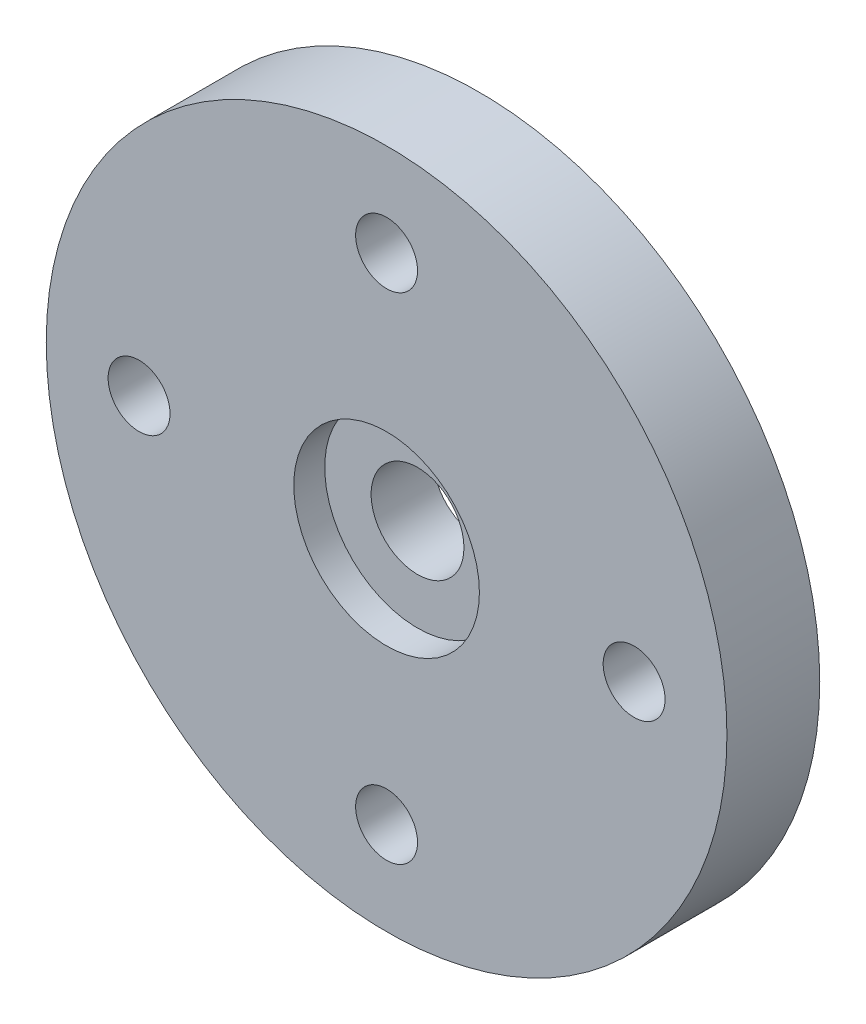
ISO-10303-21;
HEADER;
FILE_DESCRIPTION(('STEP AP214'),'2;1');
FILE_NAME('part.step','',(''),(''),'','','');
FILE_SCHEMA(('AUTOMOTIVE_DESIGN { 1 0 10303 214 1 1 1 1 }'));
ENDSEC;
DATA;
#1=APPLICATION_CONTEXT('core data for automotive mechanical design processes');
#2=APPLICATION_PROTOCOL_DEFINITION('international standard','automotive_design',2000,#1);
#3=PRODUCT_CONTEXT('',#1,'mechanical');
#4=PRODUCT('Part','Part','',(#3));
#5=PRODUCT_RELATED_PRODUCT_CATEGORY('part','',(#4));
#6=PRODUCT_DEFINITION_FORMATION('','',#4);
#7=PRODUCT_DEFINITION_CONTEXT('part definition',#1,'design');
#8=PRODUCT_DEFINITION('design','',#6,#7);
#9=PRODUCT_DEFINITION_SHAPE('','',#8);
#10=(LENGTH_UNIT() NAMED_UNIT(*) SI_UNIT(.MILLI.,.METRE.));
#11=(NAMED_UNIT(*) PLANE_ANGLE_UNIT() SI_UNIT($,.RADIAN.));
#12=(NAMED_UNIT(*) SI_UNIT($,.STERADIAN.) SOLID_ANGLE_UNIT());
#13=UNCERTAINTY_MEASURE_WITH_UNIT(LENGTH_MEASURE(1.E-05),#10,'distance_accuracy_value','');
#14=(GEOMETRIC_REPRESENTATION_CONTEXT(3) GLOBAL_UNCERTAINTY_ASSIGNED_CONTEXT((#13)) GLOBAL_UNIT_ASSIGNED_CONTEXT((#10,
#11,#12)) REPRESENTATION_CONTEXT('',''));
#15=CARTESIAN_POINT('',(0.,0.,0.));
#16=DIRECTION('',(0.,0.,1.));
#17=DIRECTION('',(1.,0.,0.));
#18=AXIS2_PLACEMENT_3D('',#15,#16,#17);
#19=CARTESIAN_POINT('',(0.,0.,3.));
#20=DIRECTION('',(0.,0.,-1.));
#21=DIRECTION('',(-1.,0.,0.));
#22=AXIS2_PLACEMENT_3D('',#19,#20,#21);
#23=CYLINDRICAL_SURFACE('',#22,1.5);
#24=CARTESIAN_POINT('',(0.,0.,0.));
#25=DIRECTION('',(0.,0.,1.));
#26=DIRECTION('',(1.,0.,0.));
#27=AXIS2_PLACEMENT_3D('',#24,#25,#26);
#28=CIRCLE('',#27,1.5);
#29=CARTESIAN_POINT('',(1.5,0.,0.));
#30=VERTEX_POINT('',#29);
#31=EDGE_CURVE('E51',#30,#30,#28,.T.);
#32=ORIENTED_EDGE('',*,*,#31,.F.);
#33=EDGE_LOOP('',(#32));
#34=FACE_BOUND('',#33,.T.);
#35=CARTESIAN_POINT('',(0.,0.,2.));
#36=DIRECTION('',(0.,0.,1.));
#37=DIRECTION('',(1.,0.,0.));
#38=AXIS2_PLACEMENT_3D('',#35,#36,#37);
#39=CIRCLE('',#38,1.5);
#40=CARTESIAN_POINT('',(1.5,0.,2.));
#41=VERTEX_POINT('',#40);
#42=EDGE_CURVE('E37',#41,#41,#39,.T.);
#43=ORIENTED_EDGE('',*,*,#42,.T.);
#44=EDGE_LOOP('',(#43));
#45=FACE_BOUND('',#44,.T.);
#46=ADVANCED_FACE('F33',(#34,#45),#23,.F.);
#47=CARTESIAN_POINT('',(0.,0.,3.));
#48=DIRECTION('',(0.,0.,1.));
#49=DIRECTION('',(1.,0.,0.));
#50=AXIS2_PLACEMENT_3D('',#47,#48,#49);
#51=PLANE('',#50);
#52=CARTESIAN_POINT('',(0.,0.,3.));
#53=DIRECTION('',(0.,0.,1.));
#54=DIRECTION('',(1.,0.,0.));
#55=AXIS2_PLACEMENT_3D('',#52,#53,#54);
#56=CIRCLE('',#55,3.);
#57=CARTESIAN_POINT('',(3.,0.,3.));
#58=VERTEX_POINT('',#57);
#59=EDGE_CURVE('E74',#58,#58,#56,.T.);
#60=ORIENTED_EDGE('',*,*,#59,.F.);
#61=EDGE_LOOP('',(#60));
#62=FACE_BOUND('',#61,.T.);
#63=CARTESIAN_POINT('',(4.51808198568511E-13,-8.,3.));
#64=DIRECTION('',(0.,0.,1.));
#65=DIRECTION('',(1.,0.,0.));
#66=AXIS2_PLACEMENT_3D('',#63,#64,#65);
#67=CIRCLE('',#66,1.00000000000049);
#68=CARTESIAN_POINT('',(1.00000000000094,-8.,3.));
#69=VERTEX_POINT('',#68);
#70=EDGE_CURVE('E60',#69,#69,#67,.T.);
#71=ORIENTED_EDGE('',*,*,#70,.F.);
#72=EDGE_LOOP('',(#71));
#73=FACE_BOUND('',#72,.T.);
#74=CARTESIAN_POINT('',(0.,0.,3.));
#75=DIRECTION('',(0.,0.,1.));
#76=DIRECTION('',(1.,0.,0.));
#77=AXIS2_PLACEMENT_3D('',#74,#75,#76);
#78=CIRCLE('',#77,11.);
#79=CARTESIAN_POINT('',(11.,0.,3.));
#80=VERTEX_POINT('',#79);
#81=EDGE_CURVE('E10',#80,#80,#78,.T.);
#82=ORIENTED_EDGE('',*,*,#81,.T.);
#83=EDGE_LOOP('',(#82));
#84=FACE_BOUND('',#83,.T.);
#85=CARTESIAN_POINT('',(0.,8.,3.));
#86=DIRECTION('',(0.,0.,1.));
#87=DIRECTION('',(1.,0.,0.));
#88=AXIS2_PLACEMENT_3D('',#85,#86,#87);
#89=CIRCLE('',#88,1.);
#90=CARTESIAN_POINT('',(1.,8.,3.));
#91=VERTEX_POINT('',#90);
#92=EDGE_CURVE('E46',#91,#91,#89,.T.);
#93=ORIENTED_EDGE('',*,*,#92,.F.);
#94=EDGE_LOOP('',(#93));
#95=FACE_BOUND('',#94,.T.);
#96=CARTESIAN_POINT('',(8.00000000000023,2.25904099284255E-13,3.));
#97=DIRECTION('',(0.,0.,1.));
#98=DIRECTION('',(1.,0.,0.));
#99=AXIS2_PLACEMENT_3D('',#96,#97,#98);
#100=CIRCLE('',#99,1.00000000000018);
#101=CARTESIAN_POINT('',(9.0000000000004,2.25904099284255E-13,3.));
#102=VERTEX_POINT('',#101);
#103=EDGE_CURVE('E56',#102,#102,#100,.T.);
#104=ORIENTED_EDGE('',*,*,#103,.F.);
#105=EDGE_LOOP('',(#104));
#106=FACE_BOUND('',#105,.T.);
#107=CARTESIAN_POINT('',(-7.99999999999977,-2.26883816723573E-13,3.));
#108=DIRECTION('',(0.,0.,1.));
#109=DIRECTION('',(1.,0.,0.));
#110=AXIS2_PLACEMENT_3D('',#107,#108,#109);
#111=CIRCLE('',#110,1.00000000000036);
#112=CARTESIAN_POINT('',(-6.99999999999941,-2.26883816723573E-13,3.));
#113=VERTEX_POINT('',#112);
#114=EDGE_CURVE('E66',#113,#113,#111,.T.);
#115=ORIENTED_EDGE('',*,*,#114,.F.);
#116=EDGE_LOOP('',(#115));
#117=FACE_BOUND('',#116,.T.);
#118=ADVANCED_FACE('F96',(#62,#73,#84,#95,#106,#117),#51,.T.);
#119=CARTESIAN_POINT('',(0.,0.,0.));
#120=DIRECTION('',(0.,0.,1.));
#121=DIRECTION('',(1.,0.,0.));
#122=AXIS2_PLACEMENT_3D('',#119,#120,#121);
#123=PLANE('',#122);
#124=CARTESIAN_POINT('',(0.,0.,0.));
#125=DIRECTION('',(0.,0.,1.));
#126=DIRECTION('',(1.,0.,0.));
#127=AXIS2_PLACEMENT_3D('',#124,#125,#126);
#128=CIRCLE('',#127,11.);
#129=CARTESIAN_POINT('',(11.,0.,0.));
#130=VERTEX_POINT('',#129);
#131=EDGE_CURVE('E41',#130,#130,#128,.T.);
#132=ORIENTED_EDGE('',*,*,#131,.F.);
#133=EDGE_LOOP('',(#132));
#134=FACE_BOUND('',#133,.T.);
#135=CARTESIAN_POINT('',(0.,8.,0.));
#136=DIRECTION('',(0.,0.,1.));
#137=DIRECTION('',(1.,0.,0.));
#138=AXIS2_PLACEMENT_3D('',#135,#136,#137);
#139=CIRCLE('',#138,1.);
#140=CARTESIAN_POINT('',(1.,8.,0.));
#141=VERTEX_POINT('',#140);
#142=EDGE_CURVE('E48',#141,#141,#139,.T.);
#143=ORIENTED_EDGE('',*,*,#142,.T.);
#144=EDGE_LOOP('',(#143));
#145=FACE_BOUND('',#144,.T.);
#146=ORIENTED_EDGE('',*,*,#31,.T.);
#147=EDGE_LOOP('',(#146));
#148=FACE_BOUND('',#147,.T.);
#149=CARTESIAN_POINT('',(8.00000000000023,2.25904099284255E-13,0.));
#150=DIRECTION('',(0.,0.,1.));
#151=DIRECTION('',(1.,0.,0.));
#152=AXIS2_PLACEMENT_3D('',#149,#150,#151);
#153=CIRCLE('',#152,1.00000000000018);
#154=CARTESIAN_POINT('',(9.0000000000004,2.25904099284255E-13,0.));
#155=VERTEX_POINT('',#154);
#156=EDGE_CURVE('E57',#155,#155,#153,.T.);
#157=ORIENTED_EDGE('',*,*,#156,.T.);
#158=EDGE_LOOP('',(#157));
#159=FACE_BOUND('',#158,.T.);
#160=CARTESIAN_POINT('',(4.51808198568511E-13,-8.,0.));
#161=DIRECTION('',(0.,0.,1.));
#162=DIRECTION('',(1.,0.,0.));
#163=AXIS2_PLACEMENT_3D('',#160,#161,#162);
#164=CIRCLE('',#163,1.00000000000049);
#165=CARTESIAN_POINT('',(1.00000000000094,-8.,0.));
#166=VERTEX_POINT('',#165);
#167=EDGE_CURVE('E63',#166,#166,#164,.T.);
#168=ORIENTED_EDGE('',*,*,#167,.T.);
#169=EDGE_LOOP('',(#168));
#170=FACE_BOUND('',#169,.T.);
#171=CARTESIAN_POINT('',(-7.99999999999977,-2.26883816723573E-13,0.));
#172=DIRECTION('',(0.,0.,1.));
#173=DIRECTION('',(1.,0.,0.));
#174=AXIS2_PLACEMENT_3D('',#171,#172,#173);
#175=CIRCLE('',#174,1.00000000000036);
#176=CARTESIAN_POINT('',(-6.99999999999941,-2.26883816723573E-13,0.));
#177=VERTEX_POINT('',#176);
#178=EDGE_CURVE('E69',#177,#177,#175,.T.);
#179=ORIENTED_EDGE('',*,*,#178,.T.);
#180=EDGE_LOOP('',(#179));
#181=FACE_BOUND('',#180,.T.);
#182=ADVANCED_FACE('F102',(#134,#145,#148,#159,#170,#181),#123,.F.);
#183=CARTESIAN_POINT('',(0.,0.,3.));
#184=DIRECTION('',(0.,0.,-1.));
#185=DIRECTION('',(-1.,0.,0.));
#186=AXIS2_PLACEMENT_3D('',#183,#184,#185);
#187=CYLINDRICAL_SURFACE('',#186,11.);
#188=ORIENTED_EDGE('',*,*,#81,.F.);
#189=EDGE_LOOP('',(#188));
#190=FACE_BOUND('',#189,.T.);
#191=ORIENTED_EDGE('',*,*,#131,.T.);
#192=EDGE_LOOP('',(#191));
#193=FACE_BOUND('',#192,.T.);
#194=ADVANCED_FACE('F35',(#190,#193),#187,.T.);
#195=CARTESIAN_POINT('',(0.,8.,3.));
#196=DIRECTION('',(0.,0.,-1.));
#197=DIRECTION('',(-1.,0.,0.));
#198=AXIS2_PLACEMENT_3D('',#195,#196,#197);
#199=CYLINDRICAL_SURFACE('',#198,1.);
#200=ORIENTED_EDGE('',*,*,#92,.T.);
#201=EDGE_LOOP('',(#200));
#202=FACE_BOUND('',#201,.T.);
#203=ORIENTED_EDGE('',*,*,#142,.F.);
#204=EDGE_LOOP('',(#203));
#205=FACE_BOUND('',#204,.T.);
#206=ADVANCED_FACE('F110',(#202,#205),#199,.F.);
#207=CARTESIAN_POINT('',(8.00000000000023,2.25904099284255E-13,3.));
#208=DIRECTION('',(0.,0.,-1.));
#209=DIRECTION('',(-1.,0.,0.));
#210=AXIS2_PLACEMENT_3D('',#207,#208,#209);
#211=CYLINDRICAL_SURFACE('',#210,1.00000000000018);
#212=ORIENTED_EDGE('',*,*,#103,.T.);
#213=EDGE_LOOP('',(#212));
#214=FACE_BOUND('',#213,.T.);
#215=ORIENTED_EDGE('',*,*,#156,.F.);
#216=EDGE_LOOP('',(#215));
#217=FACE_BOUND('',#216,.T.);
#218=ADVANCED_FACE('F108',(#214,#217),#211,.F.);
#219=CARTESIAN_POINT('',(4.51808198568511E-13,-8.,3.));
#220=DIRECTION('',(0.,0.,-1.));
#221=DIRECTION('',(-1.,0.,0.));
#222=AXIS2_PLACEMENT_3D('',#219,#220,#221);
#223=CYLINDRICAL_SURFACE('',#222,1.00000000000049);
#224=ORIENTED_EDGE('',*,*,#70,.T.);
#225=EDGE_LOOP('',(#224));
#226=FACE_BOUND('',#225,.T.);
#227=ORIENTED_EDGE('',*,*,#167,.F.);
#228=EDGE_LOOP('',(#227));
#229=FACE_BOUND('',#228,.T.);
#230=ADVANCED_FACE('F131',(#226,#229),#223,.F.);
#231=CARTESIAN_POINT('',(-7.99999999999977,-2.26883816723573E-13,3.));
#232=DIRECTION('',(0.,0.,-1.));
#233=DIRECTION('',(-1.,0.,0.));
#234=AXIS2_PLACEMENT_3D('',#231,#232,#233);
#235=CYLINDRICAL_SURFACE('',#234,1.00000000000036);
#236=ORIENTED_EDGE('',*,*,#114,.T.);
#237=EDGE_LOOP('',(#236));
#238=FACE_BOUND('',#237,.T.);
#239=ORIENTED_EDGE('',*,*,#178,.F.);
#240=EDGE_LOOP('',(#239));
#241=FACE_BOUND('',#240,.T.);
#242=ADVANCED_FACE('F92',(#238,#241),#235,.F.);
#243=CARTESIAN_POINT('',(0.,0.,2.));
#244=DIRECTION('',(0.,0.,1.));
#245=DIRECTION('',(1.,0.,0.));
#246=AXIS2_PLACEMENT_3D('',#243,#244,#245);
#247=CYLINDRICAL_SURFACE('',#246,3.);
#248=CARTESIAN_POINT('',(0.,0.,2.));
#249=DIRECTION('',(0.,0.,1.));
#250=DIRECTION('',(1.,0.,0.));
#251=AXIS2_PLACEMENT_3D('',#248,#249,#250);
#252=CIRCLE('',#251,3.);
#253=CARTESIAN_POINT('',(3.,0.,2.));
#254=VERTEX_POINT('',#253);
#255=EDGE_CURVE('E77',#254,#254,#252,.T.);
#256=ORIENTED_EDGE('',*,*,#255,.F.);
#257=EDGE_LOOP('',(#256));
#258=FACE_BOUND('',#257,.T.);
#259=ORIENTED_EDGE('',*,*,#59,.T.);
#260=EDGE_LOOP('',(#259));
#261=FACE_BOUND('',#260,.T.);
#262=ADVANCED_FACE('F87',(#258,#261),#247,.F.);
#263=CARTESIAN_POINT('',(0.,0.,2.));
#264=DIRECTION('',(0.,0.,1.));
#265=DIRECTION('',(1.,0.,0.));
#266=AXIS2_PLACEMENT_3D('',#263,#264,#265);
#267=PLANE('',#266);
#268=ORIENTED_EDGE('',*,*,#42,.F.);
#269=EDGE_LOOP('',(#268));
#270=FACE_BOUND('',#269,.T.);
#271=ORIENTED_EDGE('',*,*,#255,.T.);
#272=EDGE_LOOP('',(#271));
#273=FACE_BOUND('',#272,.T.);
#274=ADVANCED_FACE('F85',(#270,#273),#267,.T.);
#275=CLOSED_SHELL('',(#46,#118,#182,#194,#206,#218,#230,#242,#262,#274));
#276=MANIFOLD_SOLID_BREP('B2',#275);
#277=ADVANCED_BREP_SHAPE_REPRESENTATION('',(#18,#276),#14);
#278=SHAPE_DEFINITION_REPRESENTATION(#9,#277);
ENDSEC;
END-ISO-10303-21;
